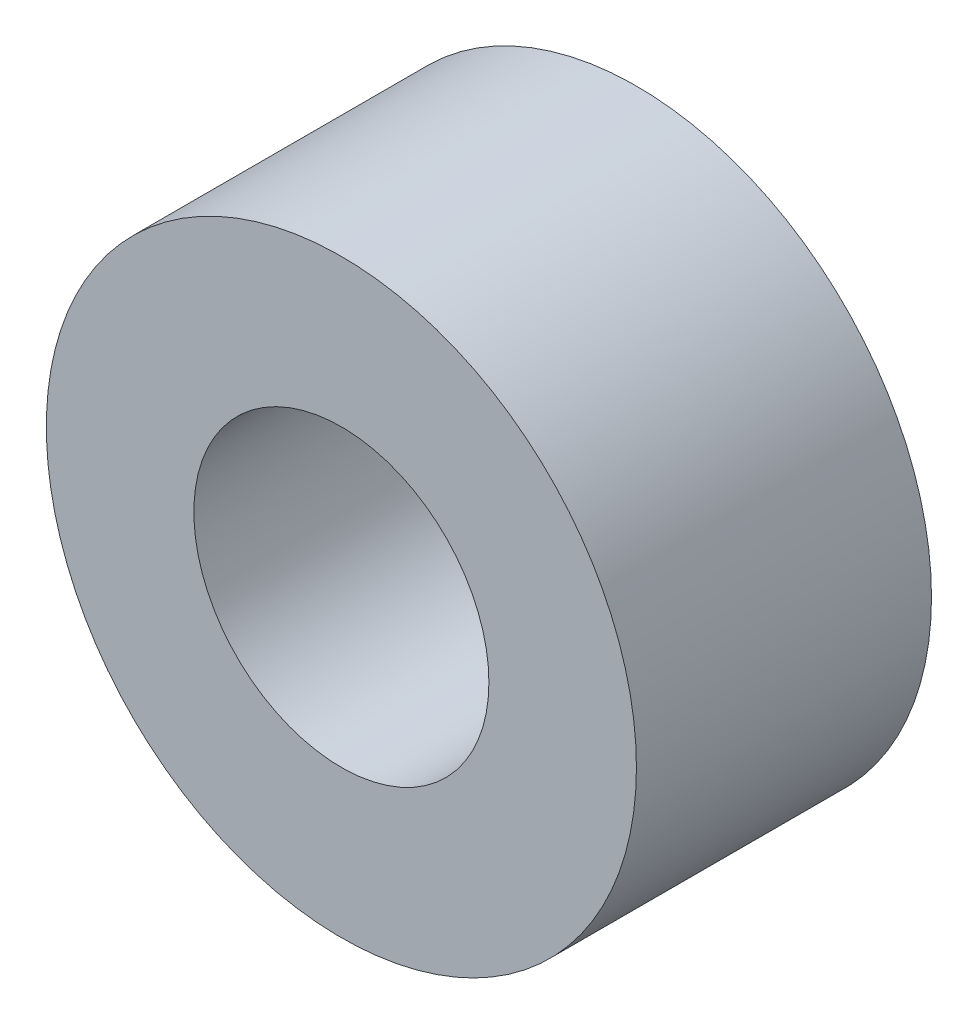
ISO-10303-21;
HEADER;
FILE_DESCRIPTION(('STEP AP214'),'2;1');
FILE_NAME('part.step','',(''),(''),'','','');
FILE_SCHEMA(('AUTOMOTIVE_DESIGN { 1 0 10303 214 1 1 1 1 }'));
ENDSEC;
DATA;
#1=APPLICATION_CONTEXT('core data for automotive mechanical design processes');
#2=APPLICATION_PROTOCOL_DEFINITION('international standard','automotive_design',2000,#1);
#3=PRODUCT_CONTEXT('',#1,'mechanical');
#4=PRODUCT('Part','Part','',(#3));
#5=PRODUCT_RELATED_PRODUCT_CATEGORY('part','',(#4));
#6=PRODUCT_DEFINITION_FORMATION('','',#4);
#7=PRODUCT_DEFINITION_CONTEXT('part definition',#1,'design');
#8=PRODUCT_DEFINITION('design','',#6,#7);
#9=PRODUCT_DEFINITION_SHAPE('','',#8);
#10=(LENGTH_UNIT() NAMED_UNIT(*) SI_UNIT(.MILLI.,.METRE.));
#11=(NAMED_UNIT(*) PLANE_ANGLE_UNIT() SI_UNIT($,.RADIAN.));
#12=(NAMED_UNIT(*) SI_UNIT($,.STERADIAN.) SOLID_ANGLE_UNIT());
#13=UNCERTAINTY_MEASURE_WITH_UNIT(LENGTH_MEASURE(1.E-05),#10,'distance_accuracy_value','');
#14=(GEOMETRIC_REPRESENTATION_CONTEXT(3) GLOBAL_UNCERTAINTY_ASSIGNED_CONTEXT((#13)) GLOBAL_UNIT_ASSIGNED_CONTEXT((#10,
#11,#12)) REPRESENTATION_CONTEXT('',''));
#15=CARTESIAN_POINT('',(0.,0.,0.));
#16=DIRECTION('',(0.,0.,1.));
#17=DIRECTION('',(1.,0.,0.));
#18=AXIS2_PLACEMENT_3D('',#15,#16,#17);
#19=CARTESIAN_POINT('',(-18.6899141321337,1.12872101995976,5.));
#20=DIRECTION('',(0.,0.,1.));
#21=DIRECTION('',(1.,0.,0.));
#22=AXIS2_PLACEMENT_3D('',#19,#20,#21);
#23=PLANE('',#22);
#24=CARTESIAN_POINT('',(-18.6899141321337,1.12872101995976,5.));
#25=DIRECTION('',(0.,0.,1.));
#26=DIRECTION('',(1.,0.,0.));
#27=AXIS2_PLACEMENT_3D('',#24,#25,#26);
#28=CIRCLE('',#27,5.);
#29=CARTESIAN_POINT('',(-13.6899141321337,1.12872101995976,5.));
#30=VERTEX_POINT('',#29);
#31=EDGE_CURVE('E10',#30,#30,#28,.T.);
#32=ORIENTED_EDGE('',*,*,#31,.T.);
#33=EDGE_LOOP('',(#32));
#34=FACE_BOUND('',#33,.T.);
#35=CARTESIAN_POINT('',(-18.6899141321337,1.12872101995976,5.));
#36=DIRECTION('',(0.,0.,1.));
#37=DIRECTION('',(1.,0.,0.));
#38=AXIS2_PLACEMENT_3D('',#35,#36,#37);
#39=CIRCLE('',#38,2.5);
#40=CARTESIAN_POINT('',(-16.1899141321337,1.12872101995976,5.));
#41=VERTEX_POINT('',#40);
#42=EDGE_CURVE('E50',#41,#41,#39,.T.);
#43=ORIENTED_EDGE('',*,*,#42,.F.);
#44=EDGE_LOOP('',(#43));
#45=FACE_BOUND('',#44,.T.);
#46=ADVANCED_FACE('F39',(#34,#45),#23,.T.);
#47=CARTESIAN_POINT('',(-18.6899141321337,1.12872101995976,0.));
#48=DIRECTION('',(0.,0.,1.));
#49=DIRECTION('',(1.,0.,0.));
#50=AXIS2_PLACEMENT_3D('',#47,#48,#49);
#51=PLANE('',#50);
#52=CARTESIAN_POINT('',(-18.6899141321337,1.12872101995976,0.));
#53=DIRECTION('',(0.,0.,1.));
#54=DIRECTION('',(1.,0.,0.));
#55=AXIS2_PLACEMENT_3D('',#52,#53,#54);
#56=CIRCLE('',#55,5.);
#57=CARTESIAN_POINT('',(-13.6899141321337,1.12872101995976,0.));
#58=VERTEX_POINT('',#57);
#59=EDGE_CURVE('E43',#58,#58,#56,.T.);
#60=ORIENTED_EDGE('',*,*,#59,.F.);
#61=EDGE_LOOP('',(#60));
#62=FACE_BOUND('',#61,.T.);
#63=CARTESIAN_POINT('',(-18.6899141321337,1.12872101995976,0.));
#64=DIRECTION('',(0.,0.,1.));
#65=DIRECTION('',(1.,0.,0.));
#66=AXIS2_PLACEMENT_3D('',#63,#64,#65);
#67=CIRCLE('',#66,2.5);
#68=CARTESIAN_POINT('',(-16.1899141321337,1.12872101995976,0.));
#69=VERTEX_POINT('',#68);
#70=EDGE_CURVE('E52',#69,#69,#67,.T.);
#71=ORIENTED_EDGE('',*,*,#70,.T.);
#72=EDGE_LOOP('',(#71));
#73=FACE_BOUND('',#72,.T.);
#74=ADVANCED_FACE('F62',(#62,#73),#51,.F.);
#75=CARTESIAN_POINT('',(-18.6899141321337,1.12872101995976,5.));
#76=DIRECTION('',(0.,0.,-1.));
#77=DIRECTION('',(-1.,0.,0.));
#78=AXIS2_PLACEMENT_3D('',#75,#76,#77);
#79=CYLINDRICAL_SURFACE('',#78,5.);
#80=ORIENTED_EDGE('',*,*,#31,.F.);
#81=EDGE_LOOP('',(#80));
#82=FACE_BOUND('',#81,.T.);
#83=ORIENTED_EDGE('',*,*,#59,.T.);
#84=EDGE_LOOP('',(#83));
#85=FACE_BOUND('',#84,.T.);
#86=ADVANCED_FACE('F41',(#82,#85),#79,.T.);
#87=CARTESIAN_POINT('',(-18.6899141321337,1.12872101995976,5.));
#88=DIRECTION('',(0.,0.,-1.));
#89=DIRECTION('',(-1.,0.,0.));
#90=AXIS2_PLACEMENT_3D('',#87,#88,#89);
#91=CYLINDRICAL_SURFACE('',#90,2.5);
#92=ORIENTED_EDGE('',*,*,#42,.T.);
#93=EDGE_LOOP('',(#92));
#94=FACE_BOUND('',#93,.T.);
#95=ORIENTED_EDGE('',*,*,#70,.F.);
#96=EDGE_LOOP('',(#95));
#97=FACE_BOUND('',#96,.T.);
#98=ADVANCED_FACE('F58',(#94,#97),#91,.F.);
#99=CLOSED_SHELL('',(#46,#74,#86,#98));
#100=MANIFOLD_SOLID_BREP('B2',#99);
#101=ADVANCED_BREP_SHAPE_REPRESENTATION('',(#18,#100),#14);
#102=SHAPE_DEFINITION_REPRESENTATION(#9,#101);
ENDSEC;
END-ISO-10303-21;
